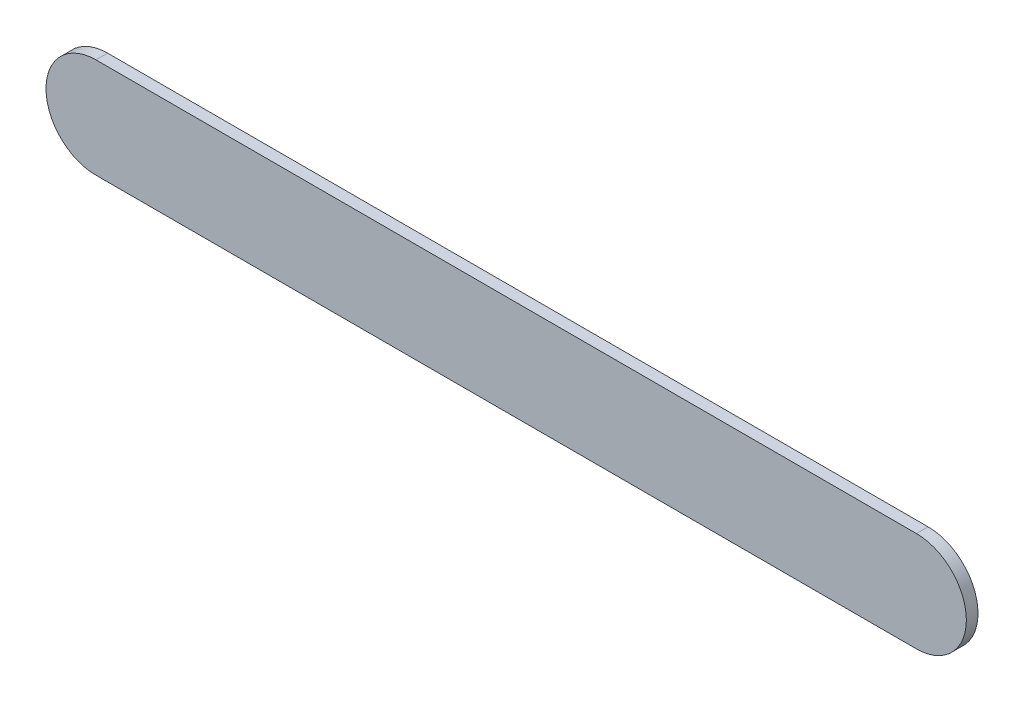
ISO-10303-21;
HEADER;
FILE_DESCRIPTION(('STEP AP214'),'2;1');
FILE_NAME('part.step','',(''),(''),'','','');
FILE_SCHEMA(('AUTOMOTIVE_DESIGN { 1 0 10303 214 1 1 1 1 }'));
ENDSEC;
DATA;
#1=APPLICATION_CONTEXT('core data for automotive mechanical design processes');
#2=APPLICATION_PROTOCOL_DEFINITION('international standard','automotive_design',2000,#1);
#3=PRODUCT_CONTEXT('',#1,'mechanical');
#4=PRODUCT('Part','Part','',(#3));
#5=PRODUCT_RELATED_PRODUCT_CATEGORY('part','',(#4));
#6=PRODUCT_DEFINITION_FORMATION('','',#4);
#7=PRODUCT_DEFINITION_CONTEXT('part definition',#1,'design');
#8=PRODUCT_DEFINITION('design','',#6,#7);
#9=PRODUCT_DEFINITION_SHAPE('','',#8);
#10=(LENGTH_UNIT() NAMED_UNIT(*) SI_UNIT(.MILLI.,.METRE.));
#11=(NAMED_UNIT(*) PLANE_ANGLE_UNIT() SI_UNIT($,.RADIAN.));
#12=(NAMED_UNIT(*) SI_UNIT($,.STERADIAN.) SOLID_ANGLE_UNIT());
#13=UNCERTAINTY_MEASURE_WITH_UNIT(LENGTH_MEASURE(1.E-05),#10,'distance_accuracy_value','');
#14=(GEOMETRIC_REPRESENTATION_CONTEXT(3) GLOBAL_UNCERTAINTY_ASSIGNED_CONTEXT((#13)) GLOBAL_UNIT_ASSIGNED_CONTEXT((#10,
#11,#12)) REPRESENTATION_CONTEXT('',''));
#15=CARTESIAN_POINT('',(0.,0.,0.));
#16=DIRECTION('',(0.,0.,1.));
#17=DIRECTION('',(1.,0.,0.));
#18=AXIS2_PLACEMENT_3D('',#15,#16,#17);
#19=CARTESIAN_POINT('',(119.684,-116.399,1.635));
#20=DIRECTION('',(0.,0.,1.));
#21=DIRECTION('',(1.,0.,0.));
#22=AXIS2_PLACEMENT_3D('',#19,#20,#21);
#23=PLANE('',#22);
#24=DIRECTION('',(-1.,0.,0.));
#25=VECTOR('',#24,1.);
#26=CARTESIAN_POINT('',(119.684,-116.399,1.635));
#27=LINE('',#26,#25);
#28=CARTESIAN_POINT('',(119.684,-116.399,1.635));
#29=VERTEX_POINT('',#28);
#30=CARTESIAN_POINT('',(117.22,-116.399,1.635));
#31=VERTEX_POINT('',#30);
#32=EDGE_CURVE('E80',#29,#31,#27,.T.);
#33=ORIENTED_EDGE('',*,*,#32,.T.);
#34=CARTESIAN_POINT('',(117.22,-116.549,1.635));
#35=DIRECTION('',(0.,0.,1.));
#36=DIRECTION('',(0.,1.,0.));
#37=AXIS2_PLACEMENT_3D('',#34,#35,#36);
#38=CIRCLE('',#37,0.15);
#39=CARTESIAN_POINT('',(117.22,-116.699,1.635));
#40=VERTEX_POINT('',#39);
#41=EDGE_CURVE('E101',#31,#40,#38,.T.);
#42=ORIENTED_EDGE('',*,*,#41,.T.);
#43=DIRECTION('',(1.,0.,0.));
#44=VECTOR('',#43,1.);
#45=CARTESIAN_POINT('',(117.22,-116.699,1.635));
#46=LINE('',#45,#44);
#47=CARTESIAN_POINT('',(119.684,-116.699,1.635));
#48=VERTEX_POINT('',#47);
#49=EDGE_CURVE('E73',#40,#48,#46,.T.);
#50=ORIENTED_EDGE('',*,*,#49,.T.);
#51=CARTESIAN_POINT('',(119.684,-116.549,1.635));
#52=DIRECTION('',(0.,0.,1.));
#53=DIRECTION('',(0.,-1.,0.));
#54=AXIS2_PLACEMENT_3D('',#51,#52,#53);
#55=CIRCLE('',#54,0.15);
#56=EDGE_CURVE('E11',#48,#29,#55,.T.);
#57=ORIENTED_EDGE('',*,*,#56,.T.);
#58=EDGE_LOOP('',(#33,#42,#50,#57));
#59=FACE_BOUND('',#58,.T.);
#60=ADVANCED_FACE('F17',(#59),#23,.T.);
#61=CARTESIAN_POINT('',(119.684,-116.399,1.6));
#62=DIRECTION('',(0.,0.,1.));
#63=DIRECTION('',(1.,0.,0.));
#64=AXIS2_PLACEMENT_3D('',#61,#62,#63);
#65=PLANE('',#64);
#66=CARTESIAN_POINT('',(119.684,-116.549,1.6));
#67=DIRECTION('',(0.,0.,1.));
#68=DIRECTION('',(0.,-1.,0.));
#69=AXIS2_PLACEMENT_3D('',#66,#67,#68);
#70=CIRCLE('',#69,0.15);
#71=CARTESIAN_POINT('',(119.684,-116.699,1.6));
#72=VERTEX_POINT('',#71);
#73=CARTESIAN_POINT('',(119.684,-116.399,1.6));
#74=VERTEX_POINT('',#73);
#75=EDGE_CURVE('E20',#72,#74,#70,.T.);
#76=ORIENTED_EDGE('',*,*,#75,.F.);
#77=DIRECTION('',(1.,0.,0.));
#78=VECTOR('',#77,1.);
#79=CARTESIAN_POINT('',(117.22,-116.699,1.6));
#80=LINE('',#79,#78);
#81=CARTESIAN_POINT('',(117.22,-116.699,1.6));
#82=VERTEX_POINT('',#81);
#83=EDGE_CURVE('E98',#82,#72,#80,.T.);
#84=ORIENTED_EDGE('',*,*,#83,.F.);
#85=CARTESIAN_POINT('',(117.22,-116.549,1.6));
#86=DIRECTION('',(0.,0.,1.));
#87=DIRECTION('',(0.,1.,0.));
#88=AXIS2_PLACEMENT_3D('',#85,#86,#87);
#89=CIRCLE('',#88,0.15);
#90=CARTESIAN_POINT('',(117.22,-116.399,1.6));
#91=VERTEX_POINT('',#90);
#92=EDGE_CURVE('E82',#91,#82,#89,.T.);
#93=ORIENTED_EDGE('',*,*,#92,.F.);
#94=DIRECTION('',(-1.,0.,0.));
#95=VECTOR('',#94,1.);
#96=CARTESIAN_POINT('',(119.684,-116.399,1.6));
#97=LINE('',#96,#95);
#98=EDGE_CURVE('E78',#74,#91,#97,.T.);
#99=ORIENTED_EDGE('',*,*,#98,.F.);
#100=EDGE_LOOP('',(#76,#84,#93,#99));
#101=FACE_BOUND('',#100,.T.);
#102=ADVANCED_FACE('F84',(#101),#65,.F.);
#103=CARTESIAN_POINT('',(119.684,-116.549,1.6));
#104=DIRECTION('',(0.,0.,-1.));
#105=DIRECTION('',(0.,-1.,0.));
#106=AXIS2_PLACEMENT_3D('',#103,#104,#105);
#107=CYLINDRICAL_SURFACE('',#106,0.15);
#108=ORIENTED_EDGE('',*,*,#75,.T.);
#109=DIRECTION('',(0.,0.,1.));
#110=VECTOR('',#109,1.);
#111=CARTESIAN_POINT('',(119.684,-116.399,1.6));
#112=LINE('',#111,#110);
#113=EDGE_CURVE('E64',#74,#29,#112,.T.);
#114=ORIENTED_EDGE('',*,*,#113,.T.);
#115=ORIENTED_EDGE('',*,*,#56,.F.);
#116=DIRECTION('',(0.,0.,1.));
#117=VECTOR('',#116,1.);
#118=CARTESIAN_POINT('',(119.684,-116.699,1.6));
#119=LINE('',#118,#117);
#120=EDGE_CURVE('E67',#72,#48,#119,.T.);
#121=ORIENTED_EDGE('',*,*,#120,.F.);
#122=EDGE_LOOP('',(#108,#114,#115,#121));
#123=FACE_BOUND('',#122,.T.);
#124=ADVANCED_FACE('F63',(#123),#107,.T.);
#125=CARTESIAN_POINT('',(117.22,-116.699,1.6));
#126=DIRECTION('',(0.,1.,0.));
#127=DIRECTION('',(1.,0.,0.));
#128=AXIS2_PLACEMENT_3D('',#125,#126,#127);
#129=PLANE('',#128);
#130=ORIENTED_EDGE('',*,*,#83,.T.);
#131=ORIENTED_EDGE('',*,*,#120,.T.);
#132=ORIENTED_EDGE('',*,*,#49,.F.);
#133=DIRECTION('',(0.,0.,1.));
#134=VECTOR('',#133,1.);
#135=CARTESIAN_POINT('',(117.22,-116.699,1.6));
#136=LINE('',#135,#134);
#137=EDGE_CURVE('E104',#82,#40,#136,.T.);
#138=ORIENTED_EDGE('',*,*,#137,.F.);
#139=EDGE_LOOP('',(#130,#131,#132,#138));
#140=FACE_BOUND('',#139,.T.);
#141=ADVANCED_FACE('F118',(#140),#129,.F.);
#142=CARTESIAN_POINT('',(117.22,-116.549,1.6));
#143=DIRECTION('',(0.,0.,-1.));
#144=DIRECTION('',(0.,1.,0.));
#145=AXIS2_PLACEMENT_3D('',#142,#143,#144);
#146=CYLINDRICAL_SURFACE('',#145,0.15);
#147=ORIENTED_EDGE('',*,*,#92,.T.);
#148=ORIENTED_EDGE('',*,*,#137,.T.);
#149=ORIENTED_EDGE('',*,*,#41,.F.);
#150=DIRECTION('',(0.,0.,1.));
#151=VECTOR('',#150,1.);
#152=CARTESIAN_POINT('',(117.22,-116.399,1.6));
#153=LINE('',#152,#151);
#154=EDGE_CURVE('E88',#91,#31,#153,.T.);
#155=ORIENTED_EDGE('',*,*,#154,.F.);
#156=EDGE_LOOP('',(#147,#148,#149,#155));
#157=FACE_BOUND('',#156,.T.);
#158=ADVANCED_FACE('F175',(#157),#146,.T.);
#159=CARTESIAN_POINT('',(119.684,-116.399,1.6));
#160=DIRECTION('',(0.,-1.,0.));
#161=DIRECTION('',(0.,0.,-1.));
#162=AXIS2_PLACEMENT_3D('',#159,#160,#161);
#163=PLANE('',#162);
#164=ORIENTED_EDGE('',*,*,#98,.T.);
#165=ORIENTED_EDGE('',*,*,#154,.T.);
#166=ORIENTED_EDGE('',*,*,#32,.F.);
#167=ORIENTED_EDGE('',*,*,#113,.F.);
#168=EDGE_LOOP('',(#164,#165,#166,#167));
#169=FACE_BOUND('',#168,.T.);
#170=ADVANCED_FACE('F76',(#169),#163,.F.);
#171=CLOSED_SHELL('',(#60,#102,#124,#141,#158,#170));
#172=MANIFOLD_SOLID_BREP('B1',#171);
#173=ADVANCED_BREP_SHAPE_REPRESENTATION('',(#18,#172),#14);
#174=SHAPE_DEFINITION_REPRESENTATION(#9,#173);
ENDSEC;
END-ISO-10303-21;
